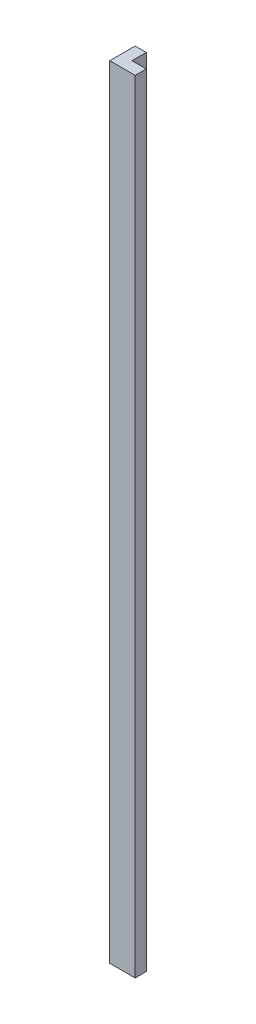
ISO-10303-21;
HEADER;
FILE_DESCRIPTION(('STEP AP214'),'2;1');
FILE_NAME('part.step','',(''),(''),'','','');
FILE_SCHEMA(('AUTOMOTIVE_DESIGN { 1 0 10303 214 1 1 1 1 }'));
ENDSEC;
DATA;
#1=APPLICATION_CONTEXT('core data for automotive mechanical design processes');
#2=APPLICATION_PROTOCOL_DEFINITION('international standard','automotive_design',2000,#1);
#3=PRODUCT_CONTEXT('',#1,'mechanical');
#4=PRODUCT('Part','Part','',(#3));
#5=PRODUCT_RELATED_PRODUCT_CATEGORY('part','',(#4));
#6=PRODUCT_DEFINITION_FORMATION('','',#4);
#7=PRODUCT_DEFINITION_CONTEXT('part definition',#1,'design');
#8=PRODUCT_DEFINITION('design','',#6,#7);
#9=PRODUCT_DEFINITION_SHAPE('','',#8);
#10=(LENGTH_UNIT() NAMED_UNIT(*) SI_UNIT(.MILLI.,.METRE.));
#11=(NAMED_UNIT(*) PLANE_ANGLE_UNIT() SI_UNIT($,.RADIAN.));
#12=(NAMED_UNIT(*) SI_UNIT($,.STERADIAN.) SOLID_ANGLE_UNIT());
#13=UNCERTAINTY_MEASURE_WITH_UNIT(LENGTH_MEASURE(1.E-05),#10,'distance_accuracy_value','');
#14=(GEOMETRIC_REPRESENTATION_CONTEXT(3) GLOBAL_UNCERTAINTY_ASSIGNED_CONTEXT((#13)) GLOBAL_UNIT_ASSIGNED_CONTEXT((#10,
#11,#12)) REPRESENTATION_CONTEXT('',''));
#15=CARTESIAN_POINT('',(0.,0.,0.));
#16=DIRECTION('',(0.,0.,1.));
#17=DIRECTION('',(1.,0.,0.));
#18=AXIS2_PLACEMENT_3D('',#15,#16,#17);
#19=CARTESIAN_POINT('',(231.775,7124.7,0.));
#20=DIRECTION('',(0.,0.,-1.));
#21=DIRECTION('',(-1.,0.,0.));
#22=AXIS2_PLACEMENT_3D('',#19,#20,#21);
#23=PLANE('',#22);
#24=DIRECTION('',(1.,0.,0.));
#25=VECTOR('',#24,1.);
#26=CARTESIAN_POINT('',(231.775,0.,0.));
#27=LINE('',#26,#25);
#28=CARTESIAN_POINT('',(0.,0.,0.));
#29=VERTEX_POINT('',#28);
#30=CARTESIAN_POINT('',(231.775,0.,0.));
#31=VERTEX_POINT('',#30);
#32=EDGE_CURVE('E128',#29,#31,#27,.T.);
#33=ORIENTED_EDGE('',*,*,#32,.T.);
#34=DIRECTION('',(0.,-1.,0.));
#35=VECTOR('',#34,1.);
#36=CARTESIAN_POINT('',(231.775,7124.7,0.));
#37=LINE('',#36,#35);
#38=CARTESIAN_POINT('',(231.775,7124.7,0.));
#39=VERTEX_POINT('',#38);
#40=EDGE_CURVE('E11',#39,#31,#37,.T.);
#41=ORIENTED_EDGE('',*,*,#40,.F.);
#42=DIRECTION('',(1.,0.,0.));
#43=VECTOR('',#42,1.);
#44=CARTESIAN_POINT('',(231.775,7124.7,0.));
#45=LINE('',#44,#43);
#46=CARTESIAN_POINT('',(0.,7124.7,0.));
#47=VERTEX_POINT('',#46);
#48=EDGE_CURVE('E144',#47,#39,#45,.T.);
#49=ORIENTED_EDGE('',*,*,#48,.F.);
#50=DIRECTION('',(0.,-1.,0.));
#51=VECTOR('',#50,1.);
#52=CARTESIAN_POINT('',(0.,7124.7,0.));
#53=LINE('',#52,#51);
#54=EDGE_CURVE('E124',#47,#29,#53,.T.);
#55=ORIENTED_EDGE('',*,*,#54,.T.);
#56=EDGE_LOOP('',(#33,#41,#49,#55));
#57=FACE_BOUND('',#56,.T.);
#58=ADVANCED_FACE('F39',(#57),#23,.F.);
#59=CARTESIAN_POINT('',(231.775,7124.7,-101.6));
#60=DIRECTION('',(-1.,0.,0.));
#61=DIRECTION('',(0.,0.,1.));
#62=AXIS2_PLACEMENT_3D('',#59,#60,#61);
#63=PLANE('',#62);
#64=DIRECTION('',(0.,0.,-1.));
#65=VECTOR('',#64,1.);
#66=CARTESIAN_POINT('',(231.775,0.,-101.6));
#67=LINE('',#66,#65);
#68=CARTESIAN_POINT('',(231.775,0.,-101.6));
#69=VERTEX_POINT('',#68);
#70=EDGE_CURVE('E132',#31,#69,#67,.T.);
#71=ORIENTED_EDGE('',*,*,#70,.T.);
#72=DIRECTION('',(0.,-1.,0.));
#73=VECTOR('',#72,1.);
#74=CARTESIAN_POINT('',(231.775,7124.7,-101.6));
#75=LINE('',#74,#73);
#76=CARTESIAN_POINT('',(231.775,7124.7,-101.6));
#77=VERTEX_POINT('',#76);
#78=EDGE_CURVE('E48',#77,#69,#75,.T.);
#79=ORIENTED_EDGE('',*,*,#78,.F.);
#80=DIRECTION('',(0.,0.,-1.));
#81=VECTOR('',#80,1.);
#82=CARTESIAN_POINT('',(231.775,7124.7,-101.6));
#83=LINE('',#82,#81);
#84=EDGE_CURVE('E93',#39,#77,#83,.T.);
#85=ORIENTED_EDGE('',*,*,#84,.F.);
#86=ORIENTED_EDGE('',*,*,#40,.T.);
#87=EDGE_LOOP('',(#71,#79,#85,#86));
#88=FACE_BOUND('',#87,.T.);
#89=ADVANCED_FACE('F172',(#88),#63,.F.);
#90=CARTESIAN_POINT('',(101.6,7124.7,-101.6));
#91=DIRECTION('',(0.,0.,1.));
#92=DIRECTION('',(1.,0.,0.));
#93=AXIS2_PLACEMENT_3D('',#90,#91,#92);
#94=PLANE('',#93);
#95=DIRECTION('',(-1.,0.,0.));
#96=VECTOR('',#95,1.);
#97=CARTESIAN_POINT('',(101.6,0.,-101.6));
#98=LINE('',#97,#96);
#99=CARTESIAN_POINT('',(101.6,0.,-101.6));
#100=VERTEX_POINT('',#99);
#101=EDGE_CURVE('E135',#69,#100,#98,.T.);
#102=ORIENTED_EDGE('',*,*,#101,.T.);
#103=DIRECTION('',(0.,-1.,0.));
#104=VECTOR('',#103,1.);
#105=CARTESIAN_POINT('',(101.6,7124.7,-101.6));
#106=LINE('',#105,#104);
#107=CARTESIAN_POINT('',(101.6,7124.7,-101.6));
#108=VERTEX_POINT('',#107);
#109=EDGE_CURVE('E117',#108,#100,#106,.T.);
#110=ORIENTED_EDGE('',*,*,#109,.F.);
#111=DIRECTION('',(-1.,0.,0.));
#112=VECTOR('',#111,1.);
#113=CARTESIAN_POINT('',(101.6,7124.7,-101.6));
#114=LINE('',#113,#112);
#115=EDGE_CURVE('E106',#77,#108,#114,.T.);
#116=ORIENTED_EDGE('',*,*,#115,.F.);
#117=ORIENTED_EDGE('',*,*,#78,.T.);
#118=EDGE_LOOP('',(#102,#110,#116,#117));
#119=FACE_BOUND('',#118,.T.);
#120=ADVANCED_FACE('F154',(#119),#94,.F.);
#121=CARTESIAN_POINT('',(101.6,7124.7,-231.775));
#122=DIRECTION('',(-1.,0.,0.));
#123=DIRECTION('',(0.,0.,1.));
#124=AXIS2_PLACEMENT_3D('',#121,#122,#123);
#125=PLANE('',#124);
#126=DIRECTION('',(0.,0.,-1.));
#127=VECTOR('',#126,1.);
#128=CARTESIAN_POINT('',(101.6,0.,-231.775));
#129=LINE('',#128,#127);
#130=CARTESIAN_POINT('',(101.6,0.,-231.775));
#131=VERTEX_POINT('',#130);
#132=EDGE_CURVE('E115',#100,#131,#129,.T.);
#133=ORIENTED_EDGE('',*,*,#132,.T.);
#134=DIRECTION('',(0.,-1.,0.));
#135=VECTOR('',#134,1.);
#136=CARTESIAN_POINT('',(101.6,7124.7,-231.775));
#137=LINE('',#136,#135);
#138=CARTESIAN_POINT('',(101.6,7124.7,-231.775));
#139=VERTEX_POINT('',#138);
#140=EDGE_CURVE('E112',#139,#131,#137,.T.);
#141=ORIENTED_EDGE('',*,*,#140,.F.);
#142=DIRECTION('',(0.,0.,-1.));
#143=VECTOR('',#142,1.);
#144=CARTESIAN_POINT('',(101.6,7124.7,-231.775));
#145=LINE('',#144,#143);
#146=EDGE_CURVE('E100',#108,#139,#145,.T.);
#147=ORIENTED_EDGE('',*,*,#146,.F.);
#148=ORIENTED_EDGE('',*,*,#109,.T.);
#149=EDGE_LOOP('',(#133,#141,#147,#148));
#150=FACE_BOUND('',#149,.T.);
#151=ADVANCED_FACE('F113',(#150),#125,.F.);
#152=CARTESIAN_POINT('',(0.,7124.7,-231.775));
#153=DIRECTION('',(0.,0.,1.));
#154=DIRECTION('',(1.,0.,0.));
#155=AXIS2_PLACEMENT_3D('',#152,#153,#154);
#156=PLANE('',#155);
#157=DIRECTION('',(-1.,0.,0.));
#158=VECTOR('',#157,1.);
#159=CARTESIAN_POINT('',(0.,0.,-231.775));
#160=LINE('',#159,#158);
#161=CARTESIAN_POINT('',(0.,0.,-231.775));
#162=VERTEX_POINT('',#161);
#163=EDGE_CURVE('E79',#131,#162,#160,.T.);
#164=ORIENTED_EDGE('',*,*,#163,.T.);
#165=DIRECTION('',(0.,-1.,0.));
#166=VECTOR('',#165,1.);
#167=CARTESIAN_POINT('',(0.,7124.7,-231.775));
#168=LINE('',#167,#166);
#169=CARTESIAN_POINT('',(0.,7124.7,-231.775));
#170=VERTEX_POINT('',#169);
#171=EDGE_CURVE('E118',#170,#162,#168,.T.);
#172=ORIENTED_EDGE('',*,*,#171,.F.);
#173=DIRECTION('',(-1.,0.,0.));
#174=VECTOR('',#173,1.);
#175=CARTESIAN_POINT('',(0.,7124.7,-231.775));
#176=LINE('',#175,#174);
#177=EDGE_CURVE('E104',#139,#170,#176,.T.);
#178=ORIENTED_EDGE('',*,*,#177,.F.);
#179=ORIENTED_EDGE('',*,*,#140,.T.);
#180=EDGE_LOOP('',(#164,#172,#178,#179));
#181=FACE_BOUND('',#180,.T.);
#182=ADVANCED_FACE('F120',(#181),#156,.F.);
#183=CARTESIAN_POINT('',(0.,7124.7,0.));
#184=DIRECTION('',(1.,0.,0.));
#185=DIRECTION('',(0.,0.,-1.));
#186=AXIS2_PLACEMENT_3D('',#183,#184,#185);
#187=PLANE('',#186);
#188=DIRECTION('',(0.,0.,1.));
#189=VECTOR('',#188,1.);
#190=CARTESIAN_POINT('',(0.,0.,0.));
#191=LINE('',#190,#189);
#192=EDGE_CURVE('E85',#162,#29,#191,.T.);
#193=ORIENTED_EDGE('',*,*,#192,.T.);
#194=ORIENTED_EDGE('',*,*,#54,.F.);
#195=DIRECTION('',(0.,0.,1.));
#196=VECTOR('',#195,1.);
#197=CARTESIAN_POINT('',(0.,7124.7,0.));
#198=LINE('',#197,#196);
#199=EDGE_CURVE('E56',#170,#47,#198,.T.);
#200=ORIENTED_EDGE('',*,*,#199,.F.);
#201=ORIENTED_EDGE('',*,*,#171,.T.);
#202=EDGE_LOOP('',(#193,#194,#200,#201));
#203=FACE_BOUND('',#202,.T.);
#204=ADVANCED_FACE('F161',(#203),#187,.F.);
#205=CARTESIAN_POINT('',(0.,7124.7,0.));
#206=DIRECTION('',(0.,-1.,0.));
#207=DIRECTION('',(0.,0.,-1.));
#208=AXIS2_PLACEMENT_3D('',#205,#206,#207);
#209=PLANE('',#208);
#210=ORIENTED_EDGE('',*,*,#48,.T.);
#211=ORIENTED_EDGE('',*,*,#84,.T.);
#212=ORIENTED_EDGE('',*,*,#115,.T.);
#213=ORIENTED_EDGE('',*,*,#146,.T.);
#214=ORIENTED_EDGE('',*,*,#177,.T.);
#215=ORIENTED_EDGE('',*,*,#199,.T.);
#216=EDGE_LOOP('',(#210,#211,#212,#213,#214,#215));
#217=FACE_BOUND('',#216,.T.);
#218=ADVANCED_FACE('F102',(#217),#209,.F.);
#219=CARTESIAN_POINT('',(0.,0.,0.));
#220=DIRECTION('',(0.,-1.,0.));
#221=DIRECTION('',(0.,0.,-1.));
#222=AXIS2_PLACEMENT_3D('',#219,#220,#221);
#223=PLANE('',#222);
#224=ORIENTED_EDGE('',*,*,#32,.F.);
#225=ORIENTED_EDGE('',*,*,#192,.F.);
#226=ORIENTED_EDGE('',*,*,#163,.F.);
#227=ORIENTED_EDGE('',*,*,#132,.F.);
#228=ORIENTED_EDGE('',*,*,#101,.F.);
#229=ORIENTED_EDGE('',*,*,#70,.F.);
#230=EDGE_LOOP('',(#224,#225,#226,#227,#228,#229));
#231=FACE_BOUND('',#230,.T.);
#232=ADVANCED_FACE('F157',(#231),#223,.T.);
#233=CLOSED_SHELL('',(#58,#89,#120,#151,#182,#204,#218,#232));
#234=MANIFOLD_SOLID_BREP('B2',#233);
#235=ADVANCED_BREP_SHAPE_REPRESENTATION('',(#18,#234),#14);
#236=SHAPE_DEFINITION_REPRESENTATION(#9,#235);
ENDSEC;
END-ISO-10303-21;
